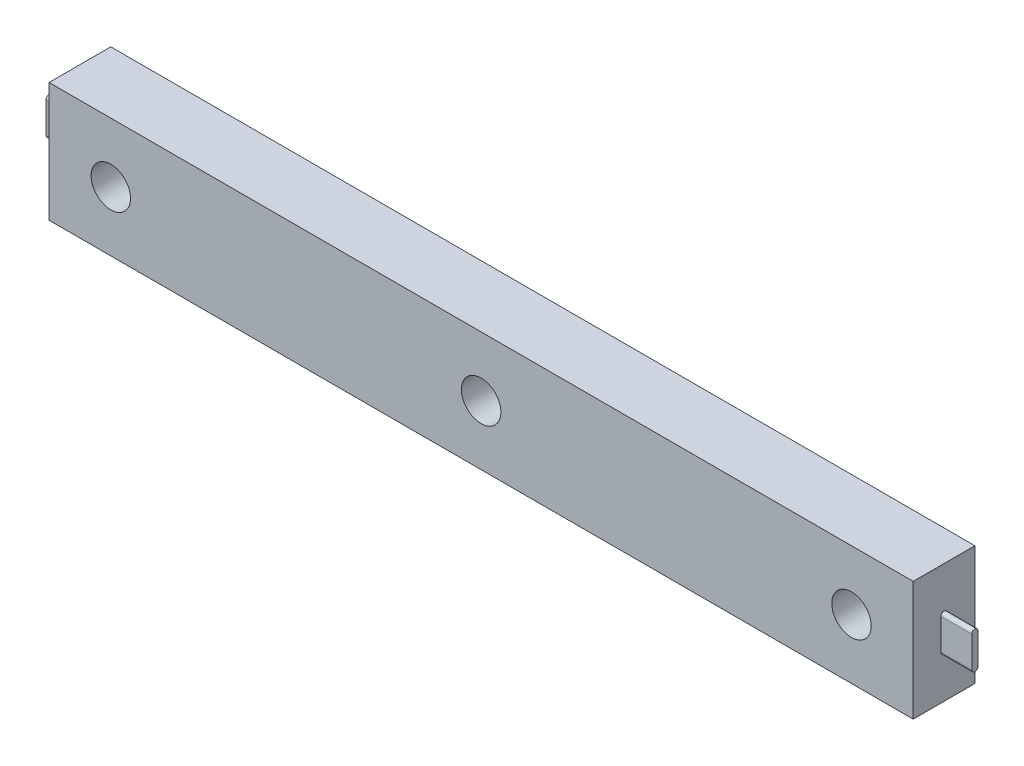
ISO-10303-21;
HEADER;
FILE_DESCRIPTION(('STEP AP214'),'2;1');
FILE_NAME('part.step','',(''),(''),'','','');
FILE_SCHEMA(('AUTOMOTIVE_DESIGN { 1 0 10303 214 1 1 1 1 }'));
ENDSEC;
DATA;
#1=APPLICATION_CONTEXT('core data for automotive mechanical design processes');
#2=APPLICATION_PROTOCOL_DEFINITION('international standard','automotive_design',2000,#1);
#3=PRODUCT_CONTEXT('',#1,'mechanical');
#4=PRODUCT('Part','Part','',(#3));
#5=PRODUCT_RELATED_PRODUCT_CATEGORY('part','',(#4));
#6=PRODUCT_DEFINITION_FORMATION('','',#4);
#7=PRODUCT_DEFINITION_CONTEXT('part definition',#1,'design');
#8=PRODUCT_DEFINITION('design','',#6,#7);
#9=PRODUCT_DEFINITION_SHAPE('','',#8);
#10=(LENGTH_UNIT() NAMED_UNIT(*) SI_UNIT(.MILLI.,.METRE.));
#11=(NAMED_UNIT(*) PLANE_ANGLE_UNIT() SI_UNIT($,.RADIAN.));
#12=(NAMED_UNIT(*) SI_UNIT($,.STERADIAN.) SOLID_ANGLE_UNIT());
#13=UNCERTAINTY_MEASURE_WITH_UNIT(LENGTH_MEASURE(1.E-05),#10,'distance_accuracy_value','');
#14=(GEOMETRIC_REPRESENTATION_CONTEXT(3) GLOBAL_UNCERTAINTY_ASSIGNED_CONTEXT((#13)) GLOBAL_UNIT_ASSIGNED_CONTEXT((#10,
#11,#12)) REPRESENTATION_CONTEXT('',''));
#15=CARTESIAN_POINT('',(0.,0.,0.));
#16=DIRECTION('',(0.,0.,1.));
#17=DIRECTION('',(1.,0.,0.));
#18=AXIS2_PLACEMENT_3D('',#15,#16,#17);
#19=CARTESIAN_POINT('',(88.8999999999999,-12.2776656431634,12.7));
#20=DIRECTION('',(-1.,0.,0.));
#21=DIRECTION('',(0.,0.,1.));
#22=AXIS2_PLACEMENT_3D('',#19,#20,#21);
#23=PLANE('',#22);
#24=DIRECTION('',(0.,1.,0.));
#25=VECTOR('',#24,1.);
#26=CARTESIAN_POINT('',(88.8999999999999,-12.2776656431634,0.));
#27=LINE('',#26,#25);
#28=CARTESIAN_POINT('',(88.8999999999999,-12.2776656431634,0.));
#29=VERTEX_POINT('',#28);
#30=CARTESIAN_POINT('',(88.8999999999999,12.2776656431634,0.));
#31=VERTEX_POINT('',#30);
#32=EDGE_CURVE('E263',#29,#31,#27,.T.);
#33=ORIENTED_EDGE('',*,*,#32,.T.);
#34=DIRECTION('',(0.,0.,-1.));
#35=VECTOR('',#34,1.);
#36=CARTESIAN_POINT('',(88.8999999999999,12.2776656431634,12.7));
#37=LINE('',#36,#35);
#38=CARTESIAN_POINT('',(88.8999999999999,12.2776656431634,12.7));
#39=VERTEX_POINT('',#38);
#40=EDGE_CURVE('E90',#39,#31,#37,.T.);
#41=ORIENTED_EDGE('',*,*,#40,.F.);
#42=DIRECTION('',(0.,1.,0.));
#43=VECTOR('',#42,1.);
#44=CARTESIAN_POINT('',(88.8999999999999,-12.2776656431634,12.7));
#45=LINE('',#44,#43);
#46=CARTESIAN_POINT('',(88.8999999999999,-12.2776656431634,12.7));
#47=VERTEX_POINT('',#46);
#48=EDGE_CURVE('E253',#47,#39,#45,.T.);
#49=ORIENTED_EDGE('',*,*,#48,.F.);
#50=DIRECTION('',(0.,0.,-1.));
#51=VECTOR('',#50,1.);
#52=CARTESIAN_POINT('',(88.8999999999999,-12.2776656431634,12.7));
#53=LINE('',#52,#51);
#54=EDGE_CURVE('E270',#47,#29,#53,.T.);
#55=ORIENTED_EDGE('',*,*,#54,.T.);
#56=EDGE_LOOP('',(#33,#41,#49,#55));
#57=FACE_BOUND('',#56,.T.);
#58=CARTESIAN_POINT('',(88.8999999999999,3.17499999999962,6.35000000000013));
#59=DIRECTION('',(1.,0.,0.));
#60=DIRECTION('',(0.,0.,-1.));
#61=AXIS2_PLACEMENT_3D('',#58,#59,#60);
#62=CIRCLE('',#61,0.635);
#63=CARTESIAN_POINT('',(88.8999999999999,3.17499999999962,5.71500000000013));
#64=VERTEX_POINT('',#63);
#65=CARTESIAN_POINT('',(88.8999999999999,3.17499999999962,6.98500000000013));
#66=VERTEX_POINT('',#65);
#67=EDGE_CURVE('E196',#64,#66,#62,.T.);
#68=ORIENTED_EDGE('',*,*,#67,.F.);
#69=DIRECTION('',(0.,1.,0.));
#70=VECTOR('',#69,1.);
#71=CARTESIAN_POINT('',(88.8999999999999,3.17499999999962,5.71500000000013));
#72=LINE('',#71,#70);
#73=CARTESIAN_POINT('',(88.8999999999999,-3.17500000000036,5.71500000000013));
#74=VERTEX_POINT('',#73);
#75=EDGE_CURVE('E193',#74,#64,#72,.T.);
#76=ORIENTED_EDGE('',*,*,#75,.F.);
#77=CARTESIAN_POINT('',(88.8999999999999,-3.17500000000036,6.35000000000013));
#78=DIRECTION('',(1.,0.,0.));
#79=DIRECTION('',(0.,0.,-1.));
#80=AXIS2_PLACEMENT_3D('',#77,#78,#79);
#81=CIRCLE('',#80,0.635);
#82=CARTESIAN_POINT('',(88.8999999999999,-3.17500000000036,6.98500000000013));
#83=VERTEX_POINT('',#82);
#84=EDGE_CURVE('E108',#83,#74,#81,.T.);
#85=ORIENTED_EDGE('',*,*,#84,.F.);
#86=DIRECTION('',(0.,-1.,0.));
#87=VECTOR('',#86,1.);
#88=CARTESIAN_POINT('',(88.8999999999999,-3.17500000000036,6.98500000000013));
#89=LINE('',#88,#87);
#90=EDGE_CURVE('E103',#66,#83,#89,.T.);
#91=ORIENTED_EDGE('',*,*,#90,.F.);
#92=EDGE_LOOP('',(#68,#76,#85,#91));
#93=FACE_BOUND('',#92,.T.);
#94=ADVANCED_FACE('F86',(#57,#93),#23,.F.);
#95=CARTESIAN_POINT('',(-88.9,-12.2776656431634,12.7));
#96=DIRECTION('',(-1.,0.,0.));
#97=DIRECTION('',(0.,0.,1.));
#98=AXIS2_PLACEMENT_3D('',#95,#96,#97);
#99=PLANE('',#98);
#100=DIRECTION('',(0.,1.,0.));
#101=VECTOR('',#100,1.);
#102=CARTESIAN_POINT('',(-88.9,-12.2776656431634,0.));
#103=LINE('',#102,#101);
#104=CARTESIAN_POINT('',(-88.9,-12.2776656431634,0.));
#105=VERTEX_POINT('',#104);
#106=CARTESIAN_POINT('',(-88.9,12.2776656431634,0.));
#107=VERTEX_POINT('',#106);
#108=EDGE_CURVE('E254',#105,#107,#103,.T.);
#109=ORIENTED_EDGE('',*,*,#108,.F.);
#110=DIRECTION('',(0.,0.,-1.));
#111=VECTOR('',#110,1.);
#112=CARTESIAN_POINT('',(-88.9,-12.2776656431634,12.7));
#113=LINE('',#112,#111);
#114=CARTESIAN_POINT('',(-88.9,-12.2776656431634,12.7));
#115=VERTEX_POINT('',#114);
#116=EDGE_CURVE('E95',#115,#105,#113,.T.);
#117=ORIENTED_EDGE('',*,*,#116,.F.);
#118=DIRECTION('',(0.,1.,0.));
#119=VECTOR('',#118,1.);
#120=CARTESIAN_POINT('',(-88.9,-12.2776656431634,12.7));
#121=LINE('',#120,#119);
#122=CARTESIAN_POINT('',(-88.9,12.2776656431634,12.7));
#123=VERTEX_POINT('',#122);
#124=EDGE_CURVE('E258',#115,#123,#121,.T.);
#125=ORIENTED_EDGE('',*,*,#124,.T.);
#126=DIRECTION('',(0.,0.,-1.));
#127=VECTOR('',#126,1.);
#128=CARTESIAN_POINT('',(-88.9,12.2776656431634,12.7));
#129=LINE('',#128,#127);
#130=EDGE_CURVE('E12',#123,#107,#129,.T.);
#131=ORIENTED_EDGE('',*,*,#130,.T.);
#132=EDGE_LOOP('',(#109,#117,#125,#131));
#133=FACE_BOUND('',#132,.T.);
#134=DIRECTION('',(0.,1.,0.));
#135=VECTOR('',#134,1.);
#136=CARTESIAN_POINT('',(-88.9,3.175,6.985));
#137=LINE('',#136,#135);
#138=CARTESIAN_POINT('',(-88.9,-3.175,6.985));
#139=VERTEX_POINT('',#138);
#140=CARTESIAN_POINT('',(-88.9,3.175,6.985));
#141=VERTEX_POINT('',#140);
#142=EDGE_CURVE('E200',#139,#141,#137,.T.);
#143=ORIENTED_EDGE('',*,*,#142,.F.);
#144=CARTESIAN_POINT('',(-88.9,-3.175,6.35));
#145=DIRECTION('',(-1.,0.,0.));
#146=DIRECTION('',(0.,0.,1.));
#147=AXIS2_PLACEMENT_3D('',#144,#145,#146);
#148=CIRCLE('',#147,0.634999999999999);
#149=CARTESIAN_POINT('',(-88.9,-3.175,5.715));
#150=VERTEX_POINT('',#149);
#151=EDGE_CURVE('E197',#150,#139,#148,.T.);
#152=ORIENTED_EDGE('',*,*,#151,.F.);
#153=DIRECTION('',(0.,-1.,0.));
#154=VECTOR('',#153,1.);
#155=CARTESIAN_POINT('',(-88.9,-3.175,5.715));
#156=LINE('',#155,#154);
#157=CARTESIAN_POINT('',(-88.9,3.175,5.715));
#158=VERTEX_POINT('',#157);
#159=EDGE_CURVE('E210',#158,#150,#156,.T.);
#160=ORIENTED_EDGE('',*,*,#159,.F.);
#161=CARTESIAN_POINT('',(-88.9,3.175,6.35));
#162=DIRECTION('',(-1.,0.,0.));
#163=DIRECTION('',(0.,0.,1.));
#164=AXIS2_PLACEMENT_3D('',#161,#162,#163);
#165=CIRCLE('',#164,0.635);
#166=EDGE_CURVE('E218',#141,#158,#165,.T.);
#167=ORIENTED_EDGE('',*,*,#166,.F.);
#168=EDGE_LOOP('',(#143,#152,#160,#167));
#169=FACE_BOUND('',#168,.T.);
#170=ADVANCED_FACE('F286',(#133,#169),#99,.T.);
#171=CARTESIAN_POINT('',(0.,0.,12.7));
#172=DIRECTION('',(0.,0.,1.));
#173=DIRECTION('',(1.,0.,0.));
#174=AXIS2_PLACEMENT_3D('',#171,#172,#173);
#175=PLANE('',#174);
#176=CARTESIAN_POINT('',(0.,0.,12.7));
#177=DIRECTION('',(0.,0.,1.));
#178=DIRECTION('',(1.,0.,0.));
#179=AXIS2_PLACEMENT_3D('',#176,#177,#178);
#180=CIRCLE('',#179,4.064);
#181=CARTESIAN_POINT('',(4.064,0.,12.7));
#182=VERTEX_POINT('',#181);
#183=EDGE_CURVE('E238',#182,#182,#180,.T.);
#184=ORIENTED_EDGE('',*,*,#183,.F.);
#185=EDGE_LOOP('',(#184));
#186=FACE_BOUND('',#185,.T.);
#187=DIRECTION('',(1.,0.,0.));
#188=VECTOR('',#187,1.);
#189=CARTESIAN_POINT('',(-88.9,12.2776656431634,12.7));
#190=LINE('',#189,#188);
#191=EDGE_CURVE('E250',#123,#39,#190,.T.);
#192=ORIENTED_EDGE('',*,*,#191,.F.);
#193=ORIENTED_EDGE('',*,*,#124,.F.);
#194=DIRECTION('',(1.,0.,0.));
#195=VECTOR('',#194,1.);
#196=CARTESIAN_POINT('',(-88.9,-12.2776656431634,12.7));
#197=LINE('',#196,#195);
#198=EDGE_CURVE('E256',#115,#47,#197,.T.);
#199=ORIENTED_EDGE('',*,*,#198,.T.);
#200=ORIENTED_EDGE('',*,*,#48,.T.);
#201=EDGE_LOOP('',(#192,#193,#199,#200));
#202=FACE_BOUND('',#201,.T.);
#203=CARTESIAN_POINT('',(-76.2,0.,12.7));
#204=DIRECTION('',(0.,0.,1.));
#205=DIRECTION('',(1.,0.,0.));
#206=AXIS2_PLACEMENT_3D('',#203,#204,#205);
#207=CIRCLE('',#206,4.064);
#208=CARTESIAN_POINT('',(-72.136,0.,12.7));
#209=VERTEX_POINT('',#208);
#210=EDGE_CURVE('E244',#209,#209,#207,.T.);
#211=ORIENTED_EDGE('',*,*,#210,.F.);
#212=EDGE_LOOP('',(#211));
#213=FACE_BOUND('',#212,.T.);
#214=CARTESIAN_POINT('',(76.2,0.,12.7));
#215=DIRECTION('',(0.,0.,1.));
#216=DIRECTION('',(1.,0.,0.));
#217=AXIS2_PLACEMENT_3D('',#214,#215,#216);
#218=CIRCLE('',#217,4.064);
#219=CARTESIAN_POINT('',(80.264,0.,12.7));
#220=VERTEX_POINT('',#219);
#221=EDGE_CURVE('E232',#220,#220,#218,.T.);
#222=ORIENTED_EDGE('',*,*,#221,.F.);
#223=EDGE_LOOP('',(#222));
#224=FACE_BOUND('',#223,.T.);
#225=ADVANCED_FACE('F291',(#186,#202,#213,#224),#175,.T.);
#226=CARTESIAN_POINT('',(0.,0.,0.));
#227=DIRECTION('',(0.,0.,1.));
#228=DIRECTION('',(1.,0.,0.));
#229=AXIS2_PLACEMENT_3D('',#226,#227,#228);
#230=PLANE('',#229);
#231=DIRECTION('',(1.,0.,0.));
#232=VECTOR('',#231,1.);
#233=CARTESIAN_POINT('',(-88.9,12.2776656431634,0.));
#234=LINE('',#233,#232);
#235=EDGE_CURVE('E247',#107,#31,#234,.T.);
#236=ORIENTED_EDGE('',*,*,#235,.T.);
#237=ORIENTED_EDGE('',*,*,#32,.F.);
#238=DIRECTION('',(1.,0.,0.));
#239=VECTOR('',#238,1.);
#240=CARTESIAN_POINT('',(-88.9,-12.2776656431634,0.));
#241=LINE('',#240,#239);
#242=EDGE_CURVE('E266',#105,#29,#241,.T.);
#243=ORIENTED_EDGE('',*,*,#242,.F.);
#244=ORIENTED_EDGE('',*,*,#108,.T.);
#245=EDGE_LOOP('',(#236,#237,#243,#244));
#246=FACE_BOUND('',#245,.T.);
#247=CARTESIAN_POINT('',(-76.2,0.,0.));
#248=DIRECTION('',(0.,0.,1.));
#249=DIRECTION('',(1.,0.,0.));
#250=AXIS2_PLACEMENT_3D('',#247,#248,#249);
#251=CIRCLE('',#250,4.064);
#252=CARTESIAN_POINT('',(-72.136,0.,0.));
#253=VERTEX_POINT('',#252);
#254=EDGE_CURVE('E241',#253,#253,#251,.T.);
#255=ORIENTED_EDGE('',*,*,#254,.T.);
#256=EDGE_LOOP('',(#255));
#257=FACE_BOUND('',#256,.T.);
#258=CARTESIAN_POINT('',(0.,0.,0.));
#259=DIRECTION('',(0.,0.,1.));
#260=DIRECTION('',(1.,0.,0.));
#261=AXIS2_PLACEMENT_3D('',#258,#259,#260);
#262=CIRCLE('',#261,4.064);
#263=CARTESIAN_POINT('',(4.064,0.,0.));
#264=VERTEX_POINT('',#263);
#265=EDGE_CURVE('E235',#264,#264,#262,.T.);
#266=ORIENTED_EDGE('',*,*,#265,.T.);
#267=EDGE_LOOP('',(#266));
#268=FACE_BOUND('',#267,.T.);
#269=CARTESIAN_POINT('',(76.2,0.,0.));
#270=DIRECTION('',(0.,0.,1.));
#271=DIRECTION('',(1.,0.,0.));
#272=AXIS2_PLACEMENT_3D('',#269,#270,#271);
#273=CIRCLE('',#272,4.064);
#274=CARTESIAN_POINT('',(80.264,0.,0.));
#275=VERTEX_POINT('',#274);
#276=EDGE_CURVE('E231',#275,#275,#273,.T.);
#277=ORIENTED_EDGE('',*,*,#276,.T.);
#278=EDGE_LOOP('',(#277));
#279=FACE_BOUND('',#278,.T.);
#280=ADVANCED_FACE('F282',(#246,#257,#268,#279),#230,.F.);
#281=CARTESIAN_POINT('',(-88.9,12.2776656431634,12.7));
#282=DIRECTION('',(0.,1.,0.));
#283=DIRECTION('',(0.,0.,1.));
#284=AXIS2_PLACEMENT_3D('',#281,#282,#283);
#285=PLANE('',#284);
#286=ORIENTED_EDGE('',*,*,#235,.F.);
#287=ORIENTED_EDGE('',*,*,#130,.F.);
#288=ORIENTED_EDGE('',*,*,#191,.T.);
#289=ORIENTED_EDGE('',*,*,#40,.T.);
#290=EDGE_LOOP('',(#286,#287,#288,#289));
#291=FACE_BOUND('',#290,.T.);
#292=ADVANCED_FACE('F88',(#291),#285,.T.);
#293=CARTESIAN_POINT('',(-88.9,-12.2776656431634,12.7));
#294=DIRECTION('',(0.,1.,0.));
#295=DIRECTION('',(0.,0.,1.));
#296=AXIS2_PLACEMENT_3D('',#293,#294,#295);
#297=PLANE('',#296);
#298=ORIENTED_EDGE('',*,*,#242,.T.);
#299=ORIENTED_EDGE('',*,*,#54,.F.);
#300=ORIENTED_EDGE('',*,*,#198,.F.);
#301=ORIENTED_EDGE('',*,*,#116,.T.);
#302=EDGE_LOOP('',(#298,#299,#300,#301));
#303=FACE_BOUND('',#302,.T.);
#304=ADVANCED_FACE('F294',(#303),#297,.F.);
#305=CARTESIAN_POINT('',(-76.2,0.,12.7));
#306=DIRECTION('',(0.,0.,-1.));
#307=DIRECTION('',(-1.,0.,0.));
#308=AXIS2_PLACEMENT_3D('',#305,#306,#307);
#309=CYLINDRICAL_SURFACE('',#308,4.064);
#310=ORIENTED_EDGE('',*,*,#210,.T.);
#311=EDGE_LOOP('',(#310));
#312=FACE_BOUND('',#311,.T.);
#313=ORIENTED_EDGE('',*,*,#254,.F.);
#314=EDGE_LOOP('',(#313));
#315=FACE_BOUND('',#314,.T.);
#316=ADVANCED_FACE('F296',(#312,#315),#309,.F.);
#317=CARTESIAN_POINT('',(0.,0.,12.7));
#318=DIRECTION('',(0.,0.,-1.));
#319=DIRECTION('',(-1.,0.,0.));
#320=AXIS2_PLACEMENT_3D('',#317,#318,#319);
#321=CYLINDRICAL_SURFACE('',#320,4.064);
#322=ORIENTED_EDGE('',*,*,#183,.T.);
#323=EDGE_LOOP('',(#322));
#324=FACE_BOUND('',#323,.T.);
#325=ORIENTED_EDGE('',*,*,#265,.F.);
#326=EDGE_LOOP('',(#325));
#327=FACE_BOUND('',#326,.T.);
#328=ADVANCED_FACE('F302',(#324,#327),#321,.F.);
#329=CARTESIAN_POINT('',(76.2,0.,12.7));
#330=DIRECTION('',(0.,0.,-1.));
#331=DIRECTION('',(-1.,0.,0.));
#332=AXIS2_PLACEMENT_3D('',#329,#330,#331);
#333=CYLINDRICAL_SURFACE('',#332,4.064);
#334=ORIENTED_EDGE('',*,*,#221,.T.);
#335=EDGE_LOOP('',(#334));
#336=FACE_BOUND('',#335,.T.);
#337=ORIENTED_EDGE('',*,*,#276,.F.);
#338=EDGE_LOOP('',(#337));
#339=FACE_BOUND('',#338,.T.);
#340=ADVANCED_FACE('F324',(#336,#339),#333,.F.);
#341=CARTESIAN_POINT('',(-95.25,-3.175,6.35));
#342=DIRECTION('',(1.,0.,0.));
#343=DIRECTION('',(0.,0.,-1.));
#344=AXIS2_PLACEMENT_3D('',#341,#342,#343);
#345=CYLINDRICAL_SURFACE('',#344,0.634999999999999);
#346=ORIENTED_EDGE('',*,*,#151,.T.);
#347=DIRECTION('',(1.,0.,0.));
#348=VECTOR('',#347,1.);
#349=CARTESIAN_POINT('',(-95.25,-3.175,6.985));
#350=LINE('',#349,#348);
#351=CARTESIAN_POINT('',(-95.25,-3.175,6.985));
#352=VERTEX_POINT('',#351);
#353=EDGE_CURVE('E229',#352,#139,#350,.T.);
#354=ORIENTED_EDGE('',*,*,#353,.F.);
#355=CARTESIAN_POINT('',(-95.25,-3.175,6.35));
#356=DIRECTION('',(-1.,0.,0.));
#357=DIRECTION('',(0.,0.,1.));
#358=AXIS2_PLACEMENT_3D('',#355,#356,#357);
#359=CIRCLE('',#358,0.634999999999999);
#360=CARTESIAN_POINT('',(-95.25,-3.175,5.715));
#361=VERTEX_POINT('',#360);
#362=EDGE_CURVE('E206',#361,#352,#359,.T.);
#363=ORIENTED_EDGE('',*,*,#362,.F.);
#364=DIRECTION('',(1.,0.,0.));
#365=VECTOR('',#364,1.);
#366=CARTESIAN_POINT('',(-95.25,-3.175,5.715));
#367=LINE('',#366,#365);
#368=EDGE_CURVE('E215',#361,#150,#367,.T.);
#369=ORIENTED_EDGE('',*,*,#368,.T.);
#370=EDGE_LOOP('',(#346,#354,#363,#369));
#371=FACE_BOUND('',#370,.T.);
#372=ADVANCED_FACE('F327',(#371),#345,.T.);
#373=CARTESIAN_POINT('',(-95.25,3.175,6.985));
#374=DIRECTION('',(0.,0.,-1.));
#375=DIRECTION('',(-1.,0.,0.));
#376=AXIS2_PLACEMENT_3D('',#373,#374,#375);
#377=PLANE('',#376);
#378=ORIENTED_EDGE('',*,*,#142,.T.);
#379=DIRECTION('',(1.,0.,0.));
#380=VECTOR('',#379,1.);
#381=CARTESIAN_POINT('',(-95.25,3.175,6.985));
#382=LINE('',#381,#380);
#383=CARTESIAN_POINT('',(-95.25,3.175,6.985));
#384=VERTEX_POINT('',#383);
#385=EDGE_CURVE('E226',#384,#141,#382,.T.);
#386=ORIENTED_EDGE('',*,*,#385,.F.);
#387=DIRECTION('',(0.,1.,0.));
#388=VECTOR('',#387,1.);
#389=CARTESIAN_POINT('',(-95.25,3.175,6.985));
#390=LINE('',#389,#388);
#391=EDGE_CURVE('E209',#352,#384,#390,.T.);
#392=ORIENTED_EDGE('',*,*,#391,.F.);
#393=ORIENTED_EDGE('',*,*,#353,.T.);
#394=EDGE_LOOP('',(#378,#386,#392,#393));
#395=FACE_BOUND('',#394,.T.);
#396=ADVANCED_FACE('F330',(#395),#377,.F.);
#397=CARTESIAN_POINT('',(-95.25,3.175,6.35));
#398=DIRECTION('',(1.,0.,0.));
#399=DIRECTION('',(0.,0.,-1.));
#400=AXIS2_PLACEMENT_3D('',#397,#398,#399);
#401=CYLINDRICAL_SURFACE('',#400,0.635);
#402=ORIENTED_EDGE('',*,*,#166,.T.);
#403=DIRECTION('',(1.,0.,0.));
#404=VECTOR('',#403,1.);
#405=CARTESIAN_POINT('',(-95.25,3.175,5.715));
#406=LINE('',#405,#404);
#407=CARTESIAN_POINT('',(-95.25,3.175,5.715));
#408=VERTEX_POINT('',#407);
#409=EDGE_CURVE('E224',#408,#158,#406,.T.);
#410=ORIENTED_EDGE('',*,*,#409,.F.);
#411=CARTESIAN_POINT('',(-95.25,3.175,6.35));
#412=DIRECTION('',(-1.,0.,0.));
#413=DIRECTION('',(0.,0.,1.));
#414=AXIS2_PLACEMENT_3D('',#411,#412,#413);
#415=CIRCLE('',#414,0.635);
#416=EDGE_CURVE('E212',#384,#408,#415,.T.);
#417=ORIENTED_EDGE('',*,*,#416,.F.);
#418=ORIENTED_EDGE('',*,*,#385,.T.);
#419=EDGE_LOOP('',(#402,#410,#417,#418));
#420=FACE_BOUND('',#419,.T.);
#421=ADVANCED_FACE('F334',(#420),#401,.T.);
#422=CARTESIAN_POINT('',(-95.25,-3.175,5.715));
#423=DIRECTION('',(0.,0.,1.));
#424=DIRECTION('',(0.,-1.,0.));
#425=AXIS2_PLACEMENT_3D('',#422,#423,#424);
#426=PLANE('',#425);
#427=ORIENTED_EDGE('',*,*,#159,.T.);
#428=ORIENTED_EDGE('',*,*,#368,.F.);
#429=DIRECTION('',(0.,-1.,0.));
#430=VECTOR('',#429,1.);
#431=CARTESIAN_POINT('',(-95.25,-3.175,5.715));
#432=LINE('',#431,#430);
#433=EDGE_CURVE('E214',#408,#361,#432,.T.);
#434=ORIENTED_EDGE('',*,*,#433,.F.);
#435=ORIENTED_EDGE('',*,*,#409,.T.);
#436=EDGE_LOOP('',(#427,#428,#434,#435));
#437=FACE_BOUND('',#436,.T.);
#438=ADVANCED_FACE('F338',(#437),#426,.F.);
#439=CARTESIAN_POINT('',(-95.25,-3.175,6.35));
#440=DIRECTION('',(-1.,0.,0.));
#441=DIRECTION('',(0.,0.,1.));
#442=AXIS2_PLACEMENT_3D('',#439,#440,#441);
#443=PLANE('',#442);
#444=ORIENTED_EDGE('',*,*,#362,.T.);
#445=ORIENTED_EDGE('',*,*,#391,.T.);
#446=ORIENTED_EDGE('',*,*,#416,.T.);
#447=ORIENTED_EDGE('',*,*,#433,.T.);
#448=EDGE_LOOP('',(#444,#445,#446,#447));
#449=FACE_BOUND('',#448,.T.);
#450=ADVANCED_FACE('F342',(#449),#443,.T.);
#451=CARTESIAN_POINT('',(95.2499999999999,3.17499999999962,6.35000000000013));
#452=DIRECTION('',(-1.,0.,0.));
#453=DIRECTION('',(0.,0.,1.));
#454=AXIS2_PLACEMENT_3D('',#451,#452,#453);
#455=CYLINDRICAL_SURFACE('',#454,0.635);
#456=ORIENTED_EDGE('',*,*,#67,.T.);
#457=DIRECTION('',(-1.,0.,0.));
#458=VECTOR('',#457,1.);
#459=CARTESIAN_POINT('',(95.2499999999999,3.17499999999962,6.98500000000013));
#460=LINE('',#459,#458);
#461=CARTESIAN_POINT('',(95.2499999999999,3.17499999999962,6.98500000000013));
#462=VERTEX_POINT('',#461);
#463=EDGE_CURVE('E177',#462,#66,#460,.T.);
#464=ORIENTED_EDGE('',*,*,#463,.F.);
#465=CARTESIAN_POINT('',(95.2499999999999,3.17499999999962,6.35000000000013));
#466=DIRECTION('',(1.,0.,0.));
#467=DIRECTION('',(0.,0.,-1.));
#468=AXIS2_PLACEMENT_3D('',#465,#466,#467);
#469=CIRCLE('',#468,0.635);
#470=CARTESIAN_POINT('',(95.2499999999999,3.17499999999962,5.71500000000013));
#471=VERTEX_POINT('',#470);
#472=EDGE_CURVE('E184',#471,#462,#469,.T.);
#473=ORIENTED_EDGE('',*,*,#472,.F.);
#474=DIRECTION('',(-1.,0.,0.));
#475=VECTOR('',#474,1.);
#476=CARTESIAN_POINT('',(95.2499999999999,3.17499999999962,5.71500000000013));
#477=LINE('',#476,#475);
#478=EDGE_CURVE('E468',#471,#64,#477,.T.);
#479=ORIENTED_EDGE('',*,*,#478,.T.);
#480=EDGE_LOOP('',(#456,#464,#473,#479));
#481=FACE_BOUND('',#480,.T.);
#482=ADVANCED_FACE('F195',(#481),#455,.T.);
#483=CARTESIAN_POINT('',(95.2499999999999,-3.17500000000036,6.98500000000013));
#484=DIRECTION('',(0.,0.,-1.));
#485=DIRECTION('',(-1.,0.,0.));
#486=AXIS2_PLACEMENT_3D('',#483,#484,#485);
#487=PLANE('',#486);
#488=ORIENTED_EDGE('',*,*,#90,.T.);
#489=DIRECTION('',(-1.,0.,0.));
#490=VECTOR('',#489,1.);
#491=CARTESIAN_POINT('',(95.2499999999999,-3.17500000000036,6.98500000000013));
#492=LINE('',#491,#490);
#493=CARTESIAN_POINT('',(95.2499999999999,-3.17500000000036,6.98500000000013));
#494=VERTEX_POINT('',#493);
#495=EDGE_CURVE('E180',#494,#83,#492,.T.);
#496=ORIENTED_EDGE('',*,*,#495,.F.);
#497=DIRECTION('',(0.,-1.,0.));
#498=VECTOR('',#497,1.);
#499=CARTESIAN_POINT('',(95.2499999999999,-3.17500000000036,6.98500000000013));
#500=LINE('',#499,#498);
#501=EDGE_CURVE('E173',#462,#494,#500,.T.);
#502=ORIENTED_EDGE('',*,*,#501,.F.);
#503=ORIENTED_EDGE('',*,*,#463,.T.);
#504=EDGE_LOOP('',(#488,#496,#502,#503));
#505=FACE_BOUND('',#504,.T.);
#506=ADVANCED_FACE('F175',(#505),#487,.F.);
#507=CARTESIAN_POINT('',(95.2499999999999,-3.17500000000036,6.35000000000013));
#508=DIRECTION('',(-1.,0.,0.));
#509=DIRECTION('',(0.,0.,1.));
#510=AXIS2_PLACEMENT_3D('',#507,#508,#509);
#511=CYLINDRICAL_SURFACE('',#510,0.635);
#512=ORIENTED_EDGE('',*,*,#84,.T.);
#513=DIRECTION('',(-1.,0.,0.));
#514=VECTOR('',#513,1.);
#515=CARTESIAN_POINT('',(95.2499999999999,-3.17500000000036,5.71500000000013));
#516=LINE('',#515,#514);
#517=CARTESIAN_POINT('',(95.2499999999999,-3.17500000000036,5.71500000000013));
#518=VERTEX_POINT('',#517);
#519=EDGE_CURVE('E202',#518,#74,#516,.T.);
#520=ORIENTED_EDGE('',*,*,#519,.F.);
#521=CARTESIAN_POINT('',(95.2499999999999,-3.17500000000036,6.35000000000013));
#522=DIRECTION('',(1.,0.,0.));
#523=DIRECTION('',(0.,0.,-1.));
#524=AXIS2_PLACEMENT_3D('',#521,#522,#523);
#525=CIRCLE('',#524,0.635);
#526=EDGE_CURVE('E183',#494,#518,#525,.T.);
#527=ORIENTED_EDGE('',*,*,#526,.F.);
#528=ORIENTED_EDGE('',*,*,#495,.T.);
#529=EDGE_LOOP('',(#512,#520,#527,#528));
#530=FACE_BOUND('',#529,.T.);
#531=ADVANCED_FACE('F349',(#530),#511,.T.);
#532=CARTESIAN_POINT('',(95.2499999999999,3.17499999999962,5.71500000000013));
#533=DIRECTION('',(0.,0.,1.));
#534=DIRECTION('',(1.,0.,0.));
#535=AXIS2_PLACEMENT_3D('',#532,#533,#534);
#536=PLANE('',#535);
#537=ORIENTED_EDGE('',*,*,#75,.T.);
#538=ORIENTED_EDGE('',*,*,#478,.F.);
#539=DIRECTION('',(0.,1.,0.));
#540=VECTOR('',#539,1.);
#541=CARTESIAN_POINT('',(95.2499999999999,3.17499999999962,5.71500000000013));
#542=LINE('',#541,#540);
#543=EDGE_CURVE('E189',#518,#471,#542,.T.);
#544=ORIENTED_EDGE('',*,*,#543,.F.);
#545=ORIENTED_EDGE('',*,*,#519,.T.);
#546=EDGE_LOOP('',(#537,#538,#544,#545));
#547=FACE_BOUND('',#546,.T.);
#548=ADVANCED_FACE('F352',(#547),#536,.F.);
#549=CARTESIAN_POINT('',(95.2499999999999,3.17499999999962,6.35000000000013));
#550=DIRECTION('',(1.,0.,0.));
#551=DIRECTION('',(0.,0.,-1.));
#552=AXIS2_PLACEMENT_3D('',#549,#550,#551);
#553=PLANE('',#552);
#554=ORIENTED_EDGE('',*,*,#472,.T.);
#555=ORIENTED_EDGE('',*,*,#501,.T.);
#556=ORIENTED_EDGE('',*,*,#526,.T.);
#557=ORIENTED_EDGE('',*,*,#543,.T.);
#558=EDGE_LOOP('',(#554,#555,#556,#557));
#559=FACE_BOUND('',#558,.T.);
#560=ADVANCED_FACE('F187',(#559),#553,.T.);
#561=CLOSED_SHELL('',(#94,#170,#225,#280,#292,#304,#316,#328,#340,#372,#396,#421,#438,#450,#482,
#506,#531,#548,#560));
#562=MANIFOLD_SOLID_BREP('B2',#561);
#563=ADVANCED_BREP_SHAPE_REPRESENTATION('',(#18,#562),#14);
#564=SHAPE_DEFINITION_REPRESENTATION(#9,#563);
ENDSEC;
END-ISO-10303-21;
